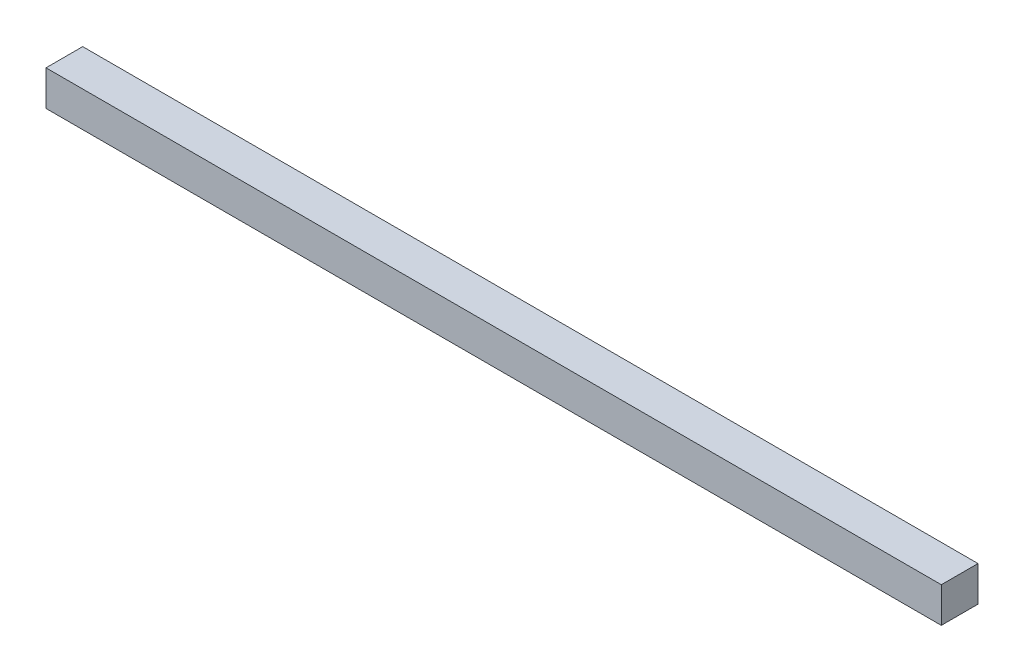
ISO-10303-21;
HEADER;
FILE_DESCRIPTION(('STEP AP214'),'2;1');
FILE_NAME('part.step','',(''),(''),'','','');
FILE_SCHEMA(('AUTOMOTIVE_DESIGN { 1 0 10303 214 1 1 1 1 }'));
ENDSEC;
DATA;
#1=APPLICATION_CONTEXT('core data for automotive mechanical design processes');
#2=APPLICATION_PROTOCOL_DEFINITION('international standard','automotive_design',2000,#1);
#3=PRODUCT_CONTEXT('',#1,'mechanical');
#4=PRODUCT('Part','Part','',(#3));
#5=PRODUCT_RELATED_PRODUCT_CATEGORY('part','',(#4));
#6=PRODUCT_DEFINITION_FORMATION('','',#4);
#7=PRODUCT_DEFINITION_CONTEXT('part definition',#1,'design');
#8=PRODUCT_DEFINITION('design','',#6,#7);
#9=PRODUCT_DEFINITION_SHAPE('','',#8);
#10=(LENGTH_UNIT() NAMED_UNIT(*) SI_UNIT(.MILLI.,.METRE.));
#11=(NAMED_UNIT(*) PLANE_ANGLE_UNIT() SI_UNIT($,.RADIAN.));
#12=(NAMED_UNIT(*) SI_UNIT($,.STERADIAN.) SOLID_ANGLE_UNIT());
#13=UNCERTAINTY_MEASURE_WITH_UNIT(LENGTH_MEASURE(1.E-05),#10,'distance_accuracy_value','');
#14=(GEOMETRIC_REPRESENTATION_CONTEXT(3) GLOBAL_UNCERTAINTY_ASSIGNED_CONTEXT((#13)) GLOBAL_UNIT_ASSIGNED_CONTEXT((#10,
#11,#12)) REPRESENTATION_CONTEXT('',''));
#15=CARTESIAN_POINT('',(0.,0.,0.));
#16=DIRECTION('',(0.,0.,1.));
#17=DIRECTION('',(1.,0.,0.));
#18=AXIS2_PLACEMENT_3D('',#15,#16,#17);
#19=CARTESIAN_POINT('',(152.5,0.,0.));
#20=DIRECTION('',(-1.,0.,0.));
#21=DIRECTION('',(0.,0.,1.));
#22=AXIS2_PLACEMENT_3D('',#19,#20,#21);
#23=PLANE('',#22);
#24=DIRECTION('',(0.,-1.,0.));
#25=VECTOR('',#24,1.);
#26=CARTESIAN_POINT('',(152.5,12.,125.));
#27=LINE('',#26,#25);
#28=CARTESIAN_POINT('',(152.5,12.,125.));
#29=VERTEX_POINT('',#28);
#30=CARTESIAN_POINT('',(152.5,0.,125.));
#31=VERTEX_POINT('',#30);
#32=EDGE_CURVE('E63',#29,#31,#27,.T.);
#33=ORIENTED_EDGE('',*,*,#32,.F.);
#34=DIRECTION('',(0.,0.,-1.));
#35=VECTOR('',#34,1.);
#36=CARTESIAN_POINT('',(152.5,12.,137.5));
#37=LINE('',#36,#35);
#38=CARTESIAN_POINT('',(152.5,12.,137.5));
#39=VERTEX_POINT('',#38);
#40=EDGE_CURVE('E61',#39,#29,#37,.T.);
#41=ORIENTED_EDGE('',*,*,#40,.F.);
#42=DIRECTION('',(0.,-1.,0.));
#43=VECTOR('',#42,1.);
#44=CARTESIAN_POINT('',(152.5,0.,137.5));
#45=LINE('',#44,#43);
#46=CARTESIAN_POINT('',(152.5,0.,137.5));
#47=VERTEX_POINT('',#46);
#48=EDGE_CURVE('E40',#39,#47,#45,.T.);
#49=ORIENTED_EDGE('',*,*,#48,.T.);
#50=DIRECTION('',(0.,0.,-1.));
#51=VECTOR('',#50,1.);
#52=CARTESIAN_POINT('',(152.5,0.,137.5));
#53=LINE('',#52,#51);
#54=EDGE_CURVE('E11',#47,#31,#53,.T.);
#55=ORIENTED_EDGE('',*,*,#54,.T.);
#56=EDGE_LOOP('',(#33,#41,#49,#55));
#57=FACE_BOUND('',#56,.T.);
#58=ADVANCED_FACE('F37',(#57),#23,.F.);
#59=CARTESIAN_POINT('',(-165.,12.,137.5));
#60=DIRECTION('',(0.,0.,-1.));
#61=DIRECTION('',(-1.,0.,0.));
#62=AXIS2_PLACEMENT_3D('',#59,#60,#61);
#63=PLANE('',#62);
#64=DIRECTION('',(1.,0.,0.));
#65=VECTOR('',#64,1.);
#66=CARTESIAN_POINT('',(-165.,12.,137.5));
#67=LINE('',#66,#65);
#68=CARTESIAN_POINT('',(-152.5,12.,137.5));
#69=VERTEX_POINT('',#68);
#70=EDGE_CURVE('E76',#69,#39,#67,.T.);
#71=ORIENTED_EDGE('',*,*,#70,.F.);
#72=DIRECTION('',(0.,-1.,0.));
#73=VECTOR('',#72,1.);
#74=CARTESIAN_POINT('',(-152.5,12.,137.5));
#75=LINE('',#74,#73);
#76=CARTESIAN_POINT('',(-152.5,0.,137.5));
#77=VERTEX_POINT('',#76);
#78=EDGE_CURVE('E69',#69,#77,#75,.T.);
#79=ORIENTED_EDGE('',*,*,#78,.T.);
#80=DIRECTION('',(1.,0.,0.));
#81=VECTOR('',#80,1.);
#82=CARTESIAN_POINT('',(-165.,0.,137.5));
#83=LINE('',#82,#81);
#84=EDGE_CURVE('E79',#77,#47,#83,.T.);
#85=ORIENTED_EDGE('',*,*,#84,.T.);
#86=ORIENTED_EDGE('',*,*,#48,.F.);
#87=EDGE_LOOP('',(#71,#79,#85,#86));
#88=FACE_BOUND('',#87,.T.);
#89=ADVANCED_FACE('F73',(#88),#63,.F.);
#90=CARTESIAN_POINT('',(-152.5,12.,125.));
#91=DIRECTION('',(0.,0.,-1.));
#92=DIRECTION('',(-1.,0.,0.));
#93=AXIS2_PLACEMENT_3D('',#90,#91,#92);
#94=PLANE('',#93);
#95=DIRECTION('',(1.,0.,0.));
#96=VECTOR('',#95,1.);
#97=CARTESIAN_POINT('',(-152.5,0.,125.));
#98=LINE('',#97,#96);
#99=CARTESIAN_POINT('',(-152.5,0.,125.));
#100=VERTEX_POINT('',#99);
#101=EDGE_CURVE('E82',#100,#31,#98,.T.);
#102=ORIENTED_EDGE('',*,*,#101,.F.);
#103=DIRECTION('',(0.,-1.,0.));
#104=VECTOR('',#103,1.);
#105=CARTESIAN_POINT('',(-152.5,12.,125.));
#106=LINE('',#105,#104);
#107=CARTESIAN_POINT('',(-152.5,12.,125.));
#108=VERTEX_POINT('',#107);
#109=EDGE_CURVE('E90',#108,#100,#106,.T.);
#110=ORIENTED_EDGE('',*,*,#109,.F.);
#111=DIRECTION('',(1.,0.,0.));
#112=VECTOR('',#111,1.);
#113=CARTESIAN_POINT('',(-152.5,12.,125.));
#114=LINE('',#113,#112);
#115=EDGE_CURVE('E93',#108,#29,#114,.T.);
#116=ORIENTED_EDGE('',*,*,#115,.T.);
#117=ORIENTED_EDGE('',*,*,#32,.T.);
#118=EDGE_LOOP('',(#102,#110,#116,#117));
#119=FACE_BOUND('',#118,.T.);
#120=ADVANCED_FACE('F98',(#119),#94,.T.);
#121=CARTESIAN_POINT('',(0.,0.,0.));
#122=DIRECTION('',(0.,-1.,0.));
#123=DIRECTION('',(0.,0.,-1.));
#124=AXIS2_PLACEMENT_3D('',#121,#122,#123);
#125=PLANE('',#124);
#126=DIRECTION('',(0.,0.,1.));
#127=VECTOR('',#126,1.);
#128=CARTESIAN_POINT('',(-152.5,0.,-137.5));
#129=LINE('',#128,#127);
#130=EDGE_CURVE('E108',#100,#77,#129,.T.);
#131=ORIENTED_EDGE('',*,*,#130,.F.);
#132=ORIENTED_EDGE('',*,*,#101,.T.);
#133=ORIENTED_EDGE('',*,*,#54,.F.);
#134=ORIENTED_EDGE('',*,*,#84,.F.);
#135=EDGE_LOOP('',(#131,#132,#133,#134));
#136=FACE_BOUND('',#135,.T.);
#137=ADVANCED_FACE('F110',(#136),#125,.T.);
#138=CARTESIAN_POINT('',(0.,12.,0.));
#139=DIRECTION('',(0.,-1.,0.));
#140=DIRECTION('',(0.,0.,-1.));
#141=AXIS2_PLACEMENT_3D('',#138,#139,#140);
#142=PLANE('',#141);
#143=ORIENTED_EDGE('',*,*,#115,.F.);
#144=DIRECTION('',(0.,0.,1.));
#145=VECTOR('',#144,1.);
#146=CARTESIAN_POINT('',(-152.5,12.,137.5));
#147=LINE('',#146,#145);
#148=EDGE_CURVE('E68',#108,#69,#147,.T.);
#149=ORIENTED_EDGE('',*,*,#148,.T.);
#150=ORIENTED_EDGE('',*,*,#70,.T.);
#151=ORIENTED_EDGE('',*,*,#40,.T.);
#152=EDGE_LOOP('',(#143,#149,#150,#151));
#153=FACE_BOUND('',#152,.T.);
#154=ADVANCED_FACE('F80',(#153),#142,.F.);
#155=CARTESIAN_POINT('',(-152.5,0.,0.));
#156=DIRECTION('',(1.,0.,0.));
#157=DIRECTION('',(0.,0.,-1.));
#158=AXIS2_PLACEMENT_3D('',#155,#156,#157);
#159=PLANE('',#158);
#160=ORIENTED_EDGE('',*,*,#109,.T.);
#161=ORIENTED_EDGE('',*,*,#130,.T.);
#162=ORIENTED_EDGE('',*,*,#78,.F.);
#163=ORIENTED_EDGE('',*,*,#148,.F.);
#164=EDGE_LOOP('',(#160,#161,#162,#163));
#165=FACE_BOUND('',#164,.T.);
#166=ADVANCED_FACE('F107',(#165),#159,.F.);
#167=CLOSED_SHELL('',(#58,#89,#120,#137,#154,#166));
#168=MANIFOLD_SOLID_BREP('B2',#167);
#169=ADVANCED_BREP_SHAPE_REPRESENTATION('',(#18,#168),#14);
#170=SHAPE_DEFINITION_REPRESENTATION(#9,#169);
ENDSEC;
END-ISO-10303-21;
